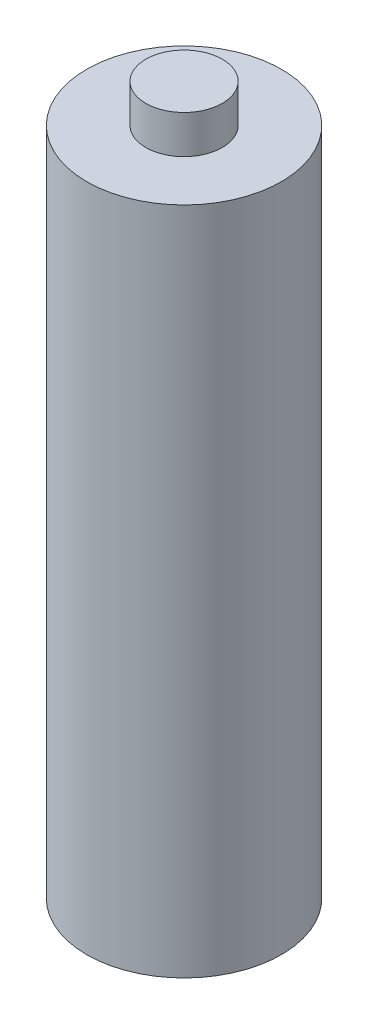
ISO-10303-21;
HEADER;
FILE_DESCRIPTION(('STEP AP214'),'2;1');
FILE_NAME('part.step','',(''),(''),'','','');
FILE_SCHEMA(('AUTOMOTIVE_DESIGN { 1 0 10303 214 1 1 1 1 }'));
ENDSEC;
DATA;
#1=APPLICATION_CONTEXT('core data for automotive mechanical design processes');
#2=APPLICATION_PROTOCOL_DEFINITION('international standard','automotive_design',2000,#1);
#3=PRODUCT_CONTEXT('',#1,'mechanical');
#4=PRODUCT('Part','Part','',(#3));
#5=PRODUCT_RELATED_PRODUCT_CATEGORY('part','',(#4));
#6=PRODUCT_DEFINITION_FORMATION('','',#4);
#7=PRODUCT_DEFINITION_CONTEXT('part definition',#1,'design');
#8=PRODUCT_DEFINITION('design','',#6,#7);
#9=PRODUCT_DEFINITION_SHAPE('','',#8);
#10=(LENGTH_UNIT() NAMED_UNIT(*) SI_UNIT(.MILLI.,.METRE.));
#11=(NAMED_UNIT(*) PLANE_ANGLE_UNIT() SI_UNIT($,.RADIAN.));
#12=(NAMED_UNIT(*) SI_UNIT($,.STERADIAN.) SOLID_ANGLE_UNIT());
#13=UNCERTAINTY_MEASURE_WITH_UNIT(LENGTH_MEASURE(1.E-05),#10,'distance_accuracy_value','');
#14=(GEOMETRIC_REPRESENTATION_CONTEXT(3) GLOBAL_UNCERTAINTY_ASSIGNED_CONTEXT((#13)) GLOBAL_UNIT_ASSIGNED_CONTEXT((#10,
#11,#12)) REPRESENTATION_CONTEXT('',''));
#15=CARTESIAN_POINT('',(0.,0.,0.));
#16=DIRECTION('',(0.,0.,1.));
#17=DIRECTION('',(1.,0.,0.));
#18=AXIS2_PLACEMENT_3D('',#15,#16,#17);
#19=CARTESIAN_POINT('',(0.,10.,0.));
#20=DIRECTION('',(0.,-1.,0.));
#21=DIRECTION('',(0.,0.,-1.));
#22=AXIS2_PLACEMENT_3D('',#19,#20,#21);
#23=CYLINDRICAL_SURFACE('',#22,10.);
#24=CARTESIAN_POINT('',(0.,10.,0.));
#25=DIRECTION('',(0.,1.,0.));
#26=DIRECTION('',(0.,0.,1.));
#27=AXIS2_PLACEMENT_3D('',#24,#25,#26);
#28=CIRCLE('',#27,10.);
#29=CARTESIAN_POINT('',(0.,10.,10.));
#30=VERTEX_POINT('',#29);
#31=EDGE_CURVE('E48',#30,#30,#28,.T.);
#32=ORIENTED_EDGE('',*,*,#31,.F.);
#33=EDGE_LOOP('',(#32));
#34=FACE_BOUND('',#33,.T.);
#35=CARTESIAN_POINT('',(0.,0.,0.));
#36=DIRECTION('',(0.,1.,0.));
#37=DIRECTION('',(0.,0.,1.));
#38=AXIS2_PLACEMENT_3D('',#35,#36,#37);
#39=CIRCLE('',#38,10.);
#40=CARTESIAN_POINT('',(0.,0.,10.));
#41=VERTEX_POINT('',#40);
#42=EDGE_CURVE('E44',#41,#41,#39,.T.);
#43=ORIENTED_EDGE('',*,*,#42,.T.);
#44=EDGE_LOOP('',(#43));
#45=FACE_BOUND('',#44,.T.);
#46=ADVANCED_FACE('F41',(#34,#45),#23,.T.);
#47=CARTESIAN_POINT('',(0.,0.,0.));
#48=DIRECTION('',(0.,1.,0.));
#49=DIRECTION('',(0.,0.,1.));
#50=AXIS2_PLACEMENT_3D('',#47,#48,#49);
#51=PLANE('',#50);
#52=ORIENTED_EDGE('',*,*,#42,.F.);
#53=EDGE_LOOP('',(#52));
#54=FACE_BOUND('',#53,.T.);
#55=ADVANCED_FACE('F82',(#54),#51,.F.);
#56=CARTESIAN_POINT('',(0.,185.,0.));
#57=DIRECTION('',(0.,-1.,0.));
#58=DIRECTION('',(0.,0.,-1.));
#59=AXIS2_PLACEMENT_3D('',#56,#57,#58);
#60=CYLINDRICAL_SURFACE('',#59,25.46);
#61=CARTESIAN_POINT('',(0.,185.,0.));
#62=DIRECTION('',(0.,1.,0.));
#63=DIRECTION('',(0.,0.,1.));
#64=AXIS2_PLACEMENT_3D('',#61,#62,#63);
#65=CIRCLE('',#64,25.46);
#66=CARTESIAN_POINT('',(0.,185.,25.46));
#67=VERTEX_POINT('',#66);
#68=EDGE_CURVE('E56',#67,#67,#65,.T.);
#69=ORIENTED_EDGE('',*,*,#68,.F.);
#70=EDGE_LOOP('',(#69));
#71=FACE_BOUND('',#70,.T.);
#72=CARTESIAN_POINT('',(0.,10.,0.));
#73=DIRECTION('',(0.,1.,0.));
#74=DIRECTION('',(0.,0.,1.));
#75=AXIS2_PLACEMENT_3D('',#72,#73,#74);
#76=CIRCLE('',#75,25.46);
#77=CARTESIAN_POINT('',(0.,10.,25.46));
#78=VERTEX_POINT('',#77);
#79=EDGE_CURVE('E59',#78,#78,#76,.T.);
#80=ORIENTED_EDGE('',*,*,#79,.T.);
#81=EDGE_LOOP('',(#80));
#82=FACE_BOUND('',#81,.T.);
#83=ADVANCED_FACE('F86',(#71,#82),#60,.T.);
#84=CARTESIAN_POINT('',(0.,185.,0.));
#85=DIRECTION('',(0.,1.,0.));
#86=DIRECTION('',(0.,0.,1.));
#87=AXIS2_PLACEMENT_3D('',#84,#85,#86);
#88=PLANE('',#87);
#89=CARTESIAN_POINT('',(0.,185.,0.));
#90=DIRECTION('',(0.,1.,0.));
#91=DIRECTION('',(0.,0.,1.));
#92=AXIS2_PLACEMENT_3D('',#89,#90,#91);
#93=CIRCLE('',#92,10.);
#94=CARTESIAN_POINT('',(0.,185.,10.));
#95=VERTEX_POINT('',#94);
#96=EDGE_CURVE('E10',#95,#95,#93,.T.);
#97=ORIENTED_EDGE('',*,*,#96,.F.);
#98=EDGE_LOOP('',(#97));
#99=FACE_BOUND('',#98,.T.);
#100=ORIENTED_EDGE('',*,*,#68,.T.);
#101=EDGE_LOOP('',(#100));
#102=FACE_BOUND('',#101,.T.);
#103=ADVANCED_FACE('F78',(#99,#102),#88,.T.);
#104=CARTESIAN_POINT('',(0.,10.,0.));
#105=DIRECTION('',(0.,1.,0.));
#106=DIRECTION('',(0.,0.,1.));
#107=AXIS2_PLACEMENT_3D('',#104,#105,#106);
#108=PLANE('',#107);
#109=ORIENTED_EDGE('',*,*,#31,.T.);
#110=EDGE_LOOP('',(#109));
#111=FACE_BOUND('',#110,.T.);
#112=ORIENTED_EDGE('',*,*,#79,.F.);
#113=EDGE_LOOP('',(#112));
#114=FACE_BOUND('',#113,.T.);
#115=ADVANCED_FACE('F70',(#111,#114),#108,.F.);
#116=CARTESIAN_POINT('',(0.,195.,0.));
#117=DIRECTION('',(0.,-1.,0.));
#118=DIRECTION('',(0.,0.,-1.));
#119=AXIS2_PLACEMENT_3D('',#116,#117,#118);
#120=CYLINDRICAL_SURFACE('',#119,10.);
#121=CARTESIAN_POINT('',(0.,195.,0.));
#122=DIRECTION('',(0.,1.,0.));
#123=DIRECTION('',(0.,0.,1.));
#124=AXIS2_PLACEMENT_3D('',#121,#122,#123);
#125=CIRCLE('',#124,10.);
#126=CARTESIAN_POINT('',(0.,195.,10.));
#127=VERTEX_POINT('',#126);
#128=EDGE_CURVE('E55',#127,#127,#125,.T.);
#129=ORIENTED_EDGE('',*,*,#128,.F.);
#130=EDGE_LOOP('',(#129));
#131=FACE_BOUND('',#130,.T.);
#132=ORIENTED_EDGE('',*,*,#96,.T.);
#133=EDGE_LOOP('',(#132));
#134=FACE_BOUND('',#133,.T.);
#135=ADVANCED_FACE('F68',(#131,#134),#120,.T.);
#136=CARTESIAN_POINT('',(0.,195.,0.));
#137=DIRECTION('',(0.,1.,0.));
#138=DIRECTION('',(0.,0.,1.));
#139=AXIS2_PLACEMENT_3D('',#136,#137,#138);
#140=PLANE('',#139);
#141=ORIENTED_EDGE('',*,*,#128,.T.);
#142=EDGE_LOOP('',(#141));
#143=FACE_BOUND('',#142,.T.);
#144=ADVANCED_FACE('F66',(#143),#140,.T.);
#145=CLOSED_SHELL('',(#46,#55,#83,#103,#115,#135,#144));
#146=MANIFOLD_SOLID_BREP('B2',#145);
#147=ADVANCED_BREP_SHAPE_REPRESENTATION('',(#18,#146),#14);
#148=SHAPE_DEFINITION_REPRESENTATION(#9,#147);
ENDSEC;
END-ISO-10303-21;
